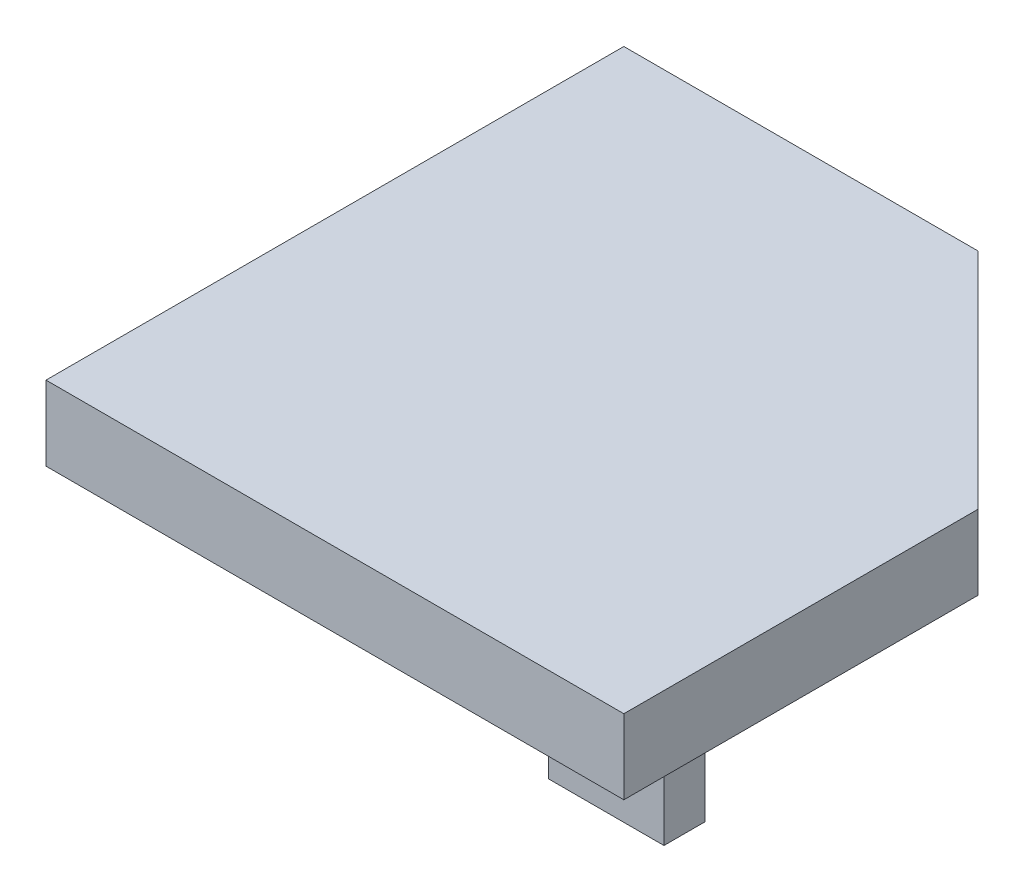
ISO-10303-21;
HEADER;
FILE_DESCRIPTION(('STEP AP214'),'2;1');
FILE_NAME('part.step','',(''),(''),'','','');
FILE_SCHEMA(('AUTOMOTIVE_DESIGN { 1 0 10303 214 1 1 1 1 }'));
ENDSEC;
DATA;
#1=APPLICATION_CONTEXT('core data for automotive mechanical design processes');
#2=APPLICATION_PROTOCOL_DEFINITION('international standard','automotive_design',2000,#1);
#3=PRODUCT_CONTEXT('',#1,'mechanical');
#4=PRODUCT('Part','Part','',(#3));
#5=PRODUCT_RELATED_PRODUCT_CATEGORY('part','',(#4));
#6=PRODUCT_DEFINITION_FORMATION('','',#4);
#7=PRODUCT_DEFINITION_CONTEXT('part definition',#1,'design');
#8=PRODUCT_DEFINITION('design','',#6,#7);
#9=PRODUCT_DEFINITION_SHAPE('','',#8);
#10=(LENGTH_UNIT() NAMED_UNIT(*) SI_UNIT(.MILLI.,.METRE.));
#11=(NAMED_UNIT(*) PLANE_ANGLE_UNIT() SI_UNIT($,.RADIAN.));
#12=(NAMED_UNIT(*) SI_UNIT($,.STERADIAN.) SOLID_ANGLE_UNIT());
#13=UNCERTAINTY_MEASURE_WITH_UNIT(LENGTH_MEASURE(1.E-05),#10,'distance_accuracy_value','');
#14=(GEOMETRIC_REPRESENTATION_CONTEXT(3) GLOBAL_UNCERTAINTY_ASSIGNED_CONTEXT((#13)) GLOBAL_UNIT_ASSIGNED_CONTEXT((#10,
#11,#12)) REPRESENTATION_CONTEXT('',''));
#15=CARTESIAN_POINT('',(0.,0.,0.));
#16=DIRECTION('',(0.,0.,1.));
#17=DIRECTION('',(1.,0.,0.));
#18=AXIS2_PLACEMENT_3D('',#15,#16,#17);
#19=CARTESIAN_POINT('',(0.,0.,0.));
#20=DIRECTION('',(0.,-1.,0.));
#21=DIRECTION('',(0.,0.,-1.));
#22=AXIS2_PLACEMENT_3D('',#19,#20,#21);
#23=PLANE('',#22);
#24=DIRECTION('',(-1.,0.,0.));
#25=VECTOR('',#24,1.);
#26=CARTESIAN_POINT('',(-9.8425,0.,-9.84250000000001));
#27=LINE('',#26,#25);
#28=CARTESIAN_POINT('',(2.22250000000001,0.,-9.84250000000001));
#29=VERTEX_POINT('',#28);
#30=CARTESIAN_POINT('',(-9.8425,0.,-9.84250000000001));
#31=VERTEX_POINT('',#30);
#32=EDGE_CURVE('E202',#29,#31,#27,.T.);
#33=ORIENTED_EDGE('',*,*,#32,.F.);
#34=DIRECTION('',(-0.707106781186546,0.,-0.707106781186549));
#35=VECTOR('',#34,1.);
#36=CARTESIAN_POINT('',(6.03250000000001,0.,-6.03249999999999));
#37=LINE('',#36,#35);
#38=CARTESIAN_POINT('',(9.8425,0.,-2.22249999999999));
#39=VERTEX_POINT('',#38);
#40=EDGE_CURVE('E58',#29,#39,#37,.F.);
#41=ORIENTED_EDGE('',*,*,#40,.T.);
#42=DIRECTION('',(0.,0.,-1.));
#43=VECTOR('',#42,1.);
#44=CARTESIAN_POINT('',(9.8425,0.,9.84249999999999));
#45=LINE('',#44,#43);
#46=CARTESIAN_POINT('',(9.8425,0.,9.84249999999999));
#47=VERTEX_POINT('',#46);
#48=EDGE_CURVE('E190',#47,#39,#45,.T.);
#49=ORIENTED_EDGE('',*,*,#48,.F.);
#50=DIRECTION('',(1.,0.,0.));
#51=VECTOR('',#50,1.);
#52=CARTESIAN_POINT('',(-9.8425,0.,9.8425));
#53=LINE('',#52,#51);
#54=CARTESIAN_POINT('',(-9.8425,0.,9.8425));
#55=VERTEX_POINT('',#54);
#56=EDGE_CURVE('E194',#55,#47,#53,.T.);
#57=ORIENTED_EDGE('',*,*,#56,.F.);
#58=DIRECTION('',(0.,0.,1.));
#59=VECTOR('',#58,1.);
#60=CARTESIAN_POINT('',(-9.8425,0.,9.8425));
#61=LINE('',#60,#59);
#62=EDGE_CURVE('E204',#31,#55,#61,.T.);
#63=ORIENTED_EDGE('',*,*,#62,.F.);
#64=EDGE_LOOP('',(#33,#41,#49,#57,#63));
#65=FACE_BOUND('',#64,.T.);
#66=DIRECTION('',(-1.,0.,0.));
#67=VECTOR('',#66,1.);
#68=CARTESIAN_POINT('',(-5.68325,0.,-3.11150000000001));
#69=LINE('',#68,#67);
#70=CARTESIAN_POINT('',(-4.28625,0.,-3.11150000000001));
#71=VERTEX_POINT('',#70);
#72=CARTESIAN_POINT('',(-5.68325,0.,-3.11150000000001));
#73=VERTEX_POINT('',#72);
#74=EDGE_CURVE('E159',#71,#73,#69,.T.);
#75=ORIENTED_EDGE('',*,*,#74,.F.);
#76=DIRECTION('',(0.,0.,1.));
#77=VECTOR('',#76,1.);
#78=CARTESIAN_POINT('',(-4.28625,0.,-7.04850000000001));
#79=LINE('',#78,#77);
#80=CARTESIAN_POINT('',(-4.28625,0.,-7.04850000000001));
#81=VERTEX_POINT('',#80);
#82=EDGE_CURVE('E156',#81,#71,#79,.T.);
#83=ORIENTED_EDGE('',*,*,#82,.F.);
#84=DIRECTION('',(1.,0.,0.));
#85=VECTOR('',#84,1.);
#86=CARTESIAN_POINT('',(-5.68325,0.,-7.04850000000001));
#87=LINE('',#86,#85);
#88=CARTESIAN_POINT('',(-5.68325,0.,-7.04850000000001));
#89=VERTEX_POINT('',#88);
#90=EDGE_CURVE('E169',#89,#81,#87,.T.);
#91=ORIENTED_EDGE('',*,*,#90,.F.);
#92=DIRECTION('',(0.,0.,-1.));
#93=VECTOR('',#92,1.);
#94=CARTESIAN_POINT('',(-5.68325,0.,-7.04850000000001));
#95=LINE('',#94,#93);
#96=EDGE_CURVE('E177',#73,#89,#95,.T.);
#97=ORIENTED_EDGE('',*,*,#96,.F.);
#98=EDGE_LOOP('',(#75,#83,#91,#97));
#99=FACE_BOUND('',#98,.T.);
#100=DIRECTION('',(-1.,0.,0.));
#101=VECTOR('',#100,1.);
#102=CARTESIAN_POINT('',(3.3655,0.,5.93598));
#103=LINE('',#102,#101);
#104=CARTESIAN_POINT('',(7.3025,0.,5.93598));
#105=VERTEX_POINT('',#104);
#106=CARTESIAN_POINT('',(3.3655,0.,5.93598));
#107=VERTEX_POINT('',#106);
#108=EDGE_CURVE('E396',#105,#107,#103,.T.);
#109=ORIENTED_EDGE('',*,*,#108,.F.);
#110=DIRECTION('',(0.,0.,1.));
#111=VECTOR('',#110,1.);
#112=CARTESIAN_POINT('',(7.3025,0.,4.53898));
#113=LINE('',#112,#111);
#114=CARTESIAN_POINT('',(7.3025,0.,4.53898));
#115=VERTEX_POINT('',#114);
#116=EDGE_CURVE('E154',#115,#105,#113,.T.);
#117=ORIENTED_EDGE('',*,*,#116,.F.);
#118=DIRECTION('',(1.,0.,0.));
#119=VECTOR('',#118,1.);
#120=CARTESIAN_POINT('',(3.3655,0.,4.53898));
#121=LINE('',#120,#119);
#122=CARTESIAN_POINT('',(3.3655,0.,4.53898));
#123=VERTEX_POINT('',#122);
#124=EDGE_CURVE('E150',#123,#115,#121,.T.);
#125=ORIENTED_EDGE('',*,*,#124,.F.);
#126=DIRECTION('',(0.,0.,-1.));
#127=VECTOR('',#126,1.);
#128=CARTESIAN_POINT('',(3.3655,0.,4.53898));
#129=LINE('',#128,#127);
#130=EDGE_CURVE('E393',#107,#123,#129,.T.);
#131=ORIENTED_EDGE('',*,*,#130,.F.);
#132=EDGE_LOOP('',(#109,#117,#125,#131));
#133=FACE_BOUND('',#132,.T.);
#134=ADVANCED_FACE('F36',(#65,#99,#133),#23,.T.);
#135=CARTESIAN_POINT('',(9.8425,2.54,9.84249999999999));
#136=DIRECTION('',(-1.,0.,0.));
#137=DIRECTION('',(0.,0.,1.));
#138=AXIS2_PLACEMENT_3D('',#135,#136,#137);
#139=PLANE('',#138);
#140=ORIENTED_EDGE('',*,*,#48,.T.);
#141=DIRECTION('',(0.,1.,0.));
#142=VECTOR('',#141,1.);
#143=CARTESIAN_POINT('',(9.8425,2.54,-2.22249999999999));
#144=LINE('',#143,#142);
#145=CARTESIAN_POINT('',(9.8425,2.54,-2.22249999999999));
#146=VERTEX_POINT('',#145);
#147=EDGE_CURVE('E44',#39,#146,#144,.T.);
#148=ORIENTED_EDGE('',*,*,#147,.T.);
#149=DIRECTION('',(0.,0.,-1.));
#150=VECTOR('',#149,1.);
#151=CARTESIAN_POINT('',(9.8425,2.54,9.84249999999999));
#152=LINE('',#151,#150);
#153=CARTESIAN_POINT('',(9.8425,2.54,9.84249999999999));
#154=VERTEX_POINT('',#153);
#155=EDGE_CURVE('E191',#154,#146,#152,.T.);
#156=ORIENTED_EDGE('',*,*,#155,.F.);
#157=DIRECTION('',(0.,-1.,0.));
#158=VECTOR('',#157,1.);
#159=CARTESIAN_POINT('',(9.8425,2.54,9.84249999999999));
#160=LINE('',#159,#158);
#161=EDGE_CURVE('E200',#154,#47,#160,.T.);
#162=ORIENTED_EDGE('',*,*,#161,.T.);
#163=EDGE_LOOP('',(#140,#148,#156,#162));
#164=FACE_BOUND('',#163,.T.);
#165=ADVANCED_FACE('F245',(#164),#139,.F.);
#166=CARTESIAN_POINT('',(-9.8425,2.54,-9.84250000000001));
#167=DIRECTION('',(0.,0.,1.));
#168=DIRECTION('',(1.,0.,0.));
#169=AXIS2_PLACEMENT_3D('',#166,#167,#168);
#170=PLANE('',#169);
#171=DIRECTION('',(-1.,0.,0.));
#172=VECTOR('',#171,1.);
#173=CARTESIAN_POINT('',(-9.8425,2.54,-9.84250000000001));
#174=LINE('',#173,#172);
#175=CARTESIAN_POINT('',(2.22250000000001,2.54,-9.84250000000001));
#176=VERTEX_POINT('',#175);
#177=CARTESIAN_POINT('',(-9.8425,2.54,-9.84250000000001));
#178=VERTEX_POINT('',#177);
#179=EDGE_CURVE('E193',#176,#178,#174,.T.);
#180=ORIENTED_EDGE('',*,*,#179,.F.);
#181=DIRECTION('',(0.,-1.,0.));
#182=VECTOR('',#181,1.);
#183=CARTESIAN_POINT('',(2.22250000000001,2.54,-9.84250000000001));
#184=LINE('',#183,#182);
#185=EDGE_CURVE('E215',#176,#29,#184,.T.);
#186=ORIENTED_EDGE('',*,*,#185,.T.);
#187=ORIENTED_EDGE('',*,*,#32,.T.);
#188=DIRECTION('',(0.,-1.,0.));
#189=VECTOR('',#188,1.);
#190=CARTESIAN_POINT('',(-9.8425,2.54,-9.84250000000001));
#191=LINE('',#190,#189);
#192=EDGE_CURVE('E212',#178,#31,#191,.T.);
#193=ORIENTED_EDGE('',*,*,#192,.F.);
#194=EDGE_LOOP('',(#180,#186,#187,#193));
#195=FACE_BOUND('',#194,.T.);
#196=ADVANCED_FACE('F221',(#195),#170,.F.);
#197=CARTESIAN_POINT('',(-9.8425,2.54,9.8425));
#198=DIRECTION('',(1.,0.,0.));
#199=DIRECTION('',(0.,0.,-1.));
#200=AXIS2_PLACEMENT_3D('',#197,#198,#199);
#201=PLANE('',#200);
#202=ORIENTED_EDGE('',*,*,#62,.T.);
#203=DIRECTION('',(0.,-1.,0.));
#204=VECTOR('',#203,1.);
#205=CARTESIAN_POINT('',(-9.8425,2.54,9.8425));
#206=LINE('',#205,#204);
#207=CARTESIAN_POINT('',(-9.8425,2.54,9.8425));
#208=VERTEX_POINT('',#207);
#209=EDGE_CURVE('E209',#208,#55,#206,.T.);
#210=ORIENTED_EDGE('',*,*,#209,.F.);
#211=DIRECTION('',(0.,0.,1.));
#212=VECTOR('',#211,1.);
#213=CARTESIAN_POINT('',(-9.8425,2.54,9.8425));
#214=LINE('',#213,#212);
#215=EDGE_CURVE('E196',#178,#208,#214,.T.);
#216=ORIENTED_EDGE('',*,*,#215,.F.);
#217=ORIENTED_EDGE('',*,*,#192,.T.);
#218=EDGE_LOOP('',(#202,#210,#216,#217));
#219=FACE_BOUND('',#218,.T.);
#220=ADVANCED_FACE('F230',(#219),#201,.F.);
#221=CARTESIAN_POINT('',(-9.8425,2.54,9.8425));
#222=DIRECTION('',(0.,0.,-1.));
#223=DIRECTION('',(-1.,0.,0.));
#224=AXIS2_PLACEMENT_3D('',#221,#222,#223);
#225=PLANE('',#224);
#226=ORIENTED_EDGE('',*,*,#56,.T.);
#227=ORIENTED_EDGE('',*,*,#161,.F.);
#228=DIRECTION('',(1.,0.,0.));
#229=VECTOR('',#228,1.);
#230=CARTESIAN_POINT('',(-9.8425,2.54,9.8425));
#231=LINE('',#230,#229);
#232=EDGE_CURVE('E198',#208,#154,#231,.T.);
#233=ORIENTED_EDGE('',*,*,#232,.F.);
#234=ORIENTED_EDGE('',*,*,#209,.T.);
#235=EDGE_LOOP('',(#226,#227,#233,#234));
#236=FACE_BOUND('',#235,.T.);
#237=ADVANCED_FACE('F234',(#236),#225,.F.);
#238=CARTESIAN_POINT('',(0.,2.54,0.));
#239=DIRECTION('',(0.,-1.,0.));
#240=DIRECTION('',(0.,0.,-1.));
#241=AXIS2_PLACEMENT_3D('',#238,#239,#240);
#242=PLANE('',#241);
#243=ORIENTED_EDGE('',*,*,#155,.T.);
#244=DIRECTION('',(0.707106781186546,0.,0.707106781186549));
#245=VECTOR('',#244,1.);
#246=CARTESIAN_POINT('',(2.22250000000001,2.54,-9.84250000000001));
#247=LINE('',#246,#245);
#248=EDGE_CURVE('E11',#146,#176,#247,.F.);
#249=ORIENTED_EDGE('',*,*,#248,.T.);
#250=ORIENTED_EDGE('',*,*,#179,.T.);
#251=ORIENTED_EDGE('',*,*,#215,.T.);
#252=ORIENTED_EDGE('',*,*,#232,.T.);
#253=EDGE_LOOP('',(#243,#249,#250,#251,#252));
#254=FACE_BOUND('',#253,.T.);
#255=ADVANCED_FACE('F237',(#254),#242,.F.);
#256=CARTESIAN_POINT('',(-4.28625,-4.572,-7.04850000000001));
#257=DIRECTION('',(-1.,0.,0.));
#258=DIRECTION('',(0.,0.,1.));
#259=AXIS2_PLACEMENT_3D('',#256,#257,#258);
#260=PLANE('',#259);
#261=ORIENTED_EDGE('',*,*,#82,.T.);
#262=DIRECTION('',(0.,1.,0.));
#263=VECTOR('',#262,1.);
#264=CARTESIAN_POINT('',(-4.28625,-4.572,-3.11150000000001));
#265=LINE('',#264,#263);
#266=CARTESIAN_POINT('',(-4.28625,-4.572,-3.11150000000001));
#267=VERTEX_POINT('',#266);
#268=EDGE_CURVE('E188',#267,#71,#265,.T.);
#269=ORIENTED_EDGE('',*,*,#268,.F.);
#270=DIRECTION('',(0.,0.,1.));
#271=VECTOR('',#270,1.);
#272=CARTESIAN_POINT('',(-4.28625,-4.572,-7.04850000000001));
#273=LINE('',#272,#271);
#274=CARTESIAN_POINT('',(-4.28625,-4.572,-7.04850000000001));
#275=VERTEX_POINT('',#274);
#276=EDGE_CURVE('E165',#275,#267,#273,.T.);
#277=ORIENTED_EDGE('',*,*,#276,.F.);
#278=DIRECTION('',(0.,1.,0.));
#279=VECTOR('',#278,1.);
#280=CARTESIAN_POINT('',(-4.28625,-4.572,-7.04850000000001));
#281=LINE('',#280,#279);
#282=EDGE_CURVE('E174',#275,#81,#281,.T.);
#283=ORIENTED_EDGE('',*,*,#282,.T.);
#284=EDGE_LOOP('',(#261,#269,#277,#283));
#285=FACE_BOUND('',#284,.T.);
#286=ADVANCED_FACE('F277',(#285),#260,.F.);
#287=CARTESIAN_POINT('',(-5.68325,-4.572,-3.11150000000001));
#288=DIRECTION('',(0.,0.,-1.));
#289=DIRECTION('',(-1.,0.,0.));
#290=AXIS2_PLACEMENT_3D('',#287,#288,#289);
#291=PLANE('',#290);
#292=ORIENTED_EDGE('',*,*,#74,.T.);
#293=DIRECTION('',(0.,1.,0.));
#294=VECTOR('',#293,1.);
#295=CARTESIAN_POINT('',(-5.68325,-4.572,-3.11150000000001));
#296=LINE('',#295,#294);
#297=CARTESIAN_POINT('',(-5.68325,-4.572,-3.11150000000001));
#298=VERTEX_POINT('',#297);
#299=EDGE_CURVE('E185',#298,#73,#296,.T.);
#300=ORIENTED_EDGE('',*,*,#299,.F.);
#301=DIRECTION('',(-1.,0.,0.));
#302=VECTOR('',#301,1.);
#303=CARTESIAN_POINT('',(-5.68325,-4.572,-3.11150000000001));
#304=LINE('',#303,#302);
#305=EDGE_CURVE('E168',#267,#298,#304,.T.);
#306=ORIENTED_EDGE('',*,*,#305,.F.);
#307=ORIENTED_EDGE('',*,*,#268,.T.);
#308=EDGE_LOOP('',(#292,#300,#306,#307));
#309=FACE_BOUND('',#308,.T.);
#310=ADVANCED_FACE('F282',(#309),#291,.F.);
#311=CARTESIAN_POINT('',(-5.68325,-4.572,-7.04850000000001));
#312=DIRECTION('',(1.,0.,0.));
#313=DIRECTION('',(0.,0.,-1.));
#314=AXIS2_PLACEMENT_3D('',#311,#312,#313);
#315=PLANE('',#314);
#316=ORIENTED_EDGE('',*,*,#96,.T.);
#317=DIRECTION('',(0.,1.,0.));
#318=VECTOR('',#317,1.);
#319=CARTESIAN_POINT('',(-5.68325,-4.572,-7.04850000000001));
#320=LINE('',#319,#318);
#321=CARTESIAN_POINT('',(-5.68325,-4.572,-7.04850000000001));
#322=VERTEX_POINT('',#321);
#323=EDGE_CURVE('E183',#322,#89,#320,.T.);
#324=ORIENTED_EDGE('',*,*,#323,.F.);
#325=DIRECTION('',(0.,0.,-1.));
#326=VECTOR('',#325,1.);
#327=CARTESIAN_POINT('',(-5.68325,-4.572,-7.04850000000001));
#328=LINE('',#327,#326);
#329=EDGE_CURVE('E171',#298,#322,#328,.T.);
#330=ORIENTED_EDGE('',*,*,#329,.F.);
#331=ORIENTED_EDGE('',*,*,#299,.T.);
#332=EDGE_LOOP('',(#316,#324,#330,#331));
#333=FACE_BOUND('',#332,.T.);
#334=ADVANCED_FACE('F289',(#333),#315,.F.);
#335=CARTESIAN_POINT('',(-5.68325,-4.572,-7.04850000000001));
#336=DIRECTION('',(0.,0.,1.));
#337=DIRECTION('',(1.,0.,0.));
#338=AXIS2_PLACEMENT_3D('',#335,#336,#337);
#339=PLANE('',#338);
#340=ORIENTED_EDGE('',*,*,#90,.T.);
#341=ORIENTED_EDGE('',*,*,#282,.F.);
#342=DIRECTION('',(1.,0.,0.));
#343=VECTOR('',#342,1.);
#344=CARTESIAN_POINT('',(-5.68325,-4.572,-7.04850000000001));
#345=LINE('',#344,#343);
#346=EDGE_CURVE('E173',#322,#275,#345,.T.);
#347=ORIENTED_EDGE('',*,*,#346,.F.);
#348=ORIENTED_EDGE('',*,*,#323,.T.);
#349=EDGE_LOOP('',(#340,#341,#347,#348));
#350=FACE_BOUND('',#349,.T.);
#351=ADVANCED_FACE('F297',(#350),#339,.F.);
#352=CARTESIAN_POINT('',(0.,-4.572,0.));
#353=DIRECTION('',(0.,1.,0.));
#354=DIRECTION('',(0.,0.,1.));
#355=AXIS2_PLACEMENT_3D('',#352,#353,#354);
#356=PLANE('',#355);
#357=ORIENTED_EDGE('',*,*,#276,.T.);
#358=ORIENTED_EDGE('',*,*,#305,.T.);
#359=ORIENTED_EDGE('',*,*,#329,.T.);
#360=ORIENTED_EDGE('',*,*,#346,.T.);
#361=EDGE_LOOP('',(#357,#358,#359,#360));
#362=FACE_BOUND('',#361,.T.);
#363=ADVANCED_FACE('F305',(#362),#356,.F.);
#364=CARTESIAN_POINT('',(7.3025,-4.572,4.53898));
#365=DIRECTION('',(-1.,0.,0.));
#366=DIRECTION('',(0.,0.,1.));
#367=AXIS2_PLACEMENT_3D('',#364,#365,#366);
#368=PLANE('',#367);
#369=ORIENTED_EDGE('',*,*,#116,.T.);
#370=DIRECTION('',(0.,1.,0.));
#371=VECTOR('',#370,1.);
#372=CARTESIAN_POINT('',(7.3025,-4.572,5.93598));
#373=LINE('',#372,#371);
#374=CARTESIAN_POINT('',(7.3025,-4.572,5.93598));
#375=VERTEX_POINT('',#374);
#376=EDGE_CURVE('E134',#375,#105,#373,.T.);
#377=ORIENTED_EDGE('',*,*,#376,.F.);
#378=DIRECTION('',(0.,0.,1.));
#379=VECTOR('',#378,1.);
#380=CARTESIAN_POINT('',(7.3025,-4.572,4.53898));
#381=LINE('',#380,#379);
#382=CARTESIAN_POINT('',(7.3025,-4.572,4.53898));
#383=VERTEX_POINT('',#382);
#384=EDGE_CURVE('E141',#383,#375,#381,.T.);
#385=ORIENTED_EDGE('',*,*,#384,.F.);
#386=DIRECTION('',(0.,1.,0.));
#387=VECTOR('',#386,1.);
#388=CARTESIAN_POINT('',(7.3025,-4.572,4.53898));
#389=LINE('',#388,#387);
#390=EDGE_CURVE('E388',#383,#115,#389,.T.);
#391=ORIENTED_EDGE('',*,*,#390,.T.);
#392=EDGE_LOOP('',(#369,#377,#385,#391));
#393=FACE_BOUND('',#392,.T.);
#394=ADVANCED_FACE('F152',(#393),#368,.F.);
#395=CARTESIAN_POINT('',(3.3655,-4.572,5.93598));
#396=DIRECTION('',(0.,0.,-1.));
#397=DIRECTION('',(-1.,0.,0.));
#398=AXIS2_PLACEMENT_3D('',#395,#396,#397);
#399=PLANE('',#398);
#400=ORIENTED_EDGE('',*,*,#108,.T.);
#401=DIRECTION('',(0.,1.,0.));
#402=VECTOR('',#401,1.);
#403=CARTESIAN_POINT('',(3.3655,-4.572,5.93598));
#404=LINE('',#403,#402);
#405=CARTESIAN_POINT('',(3.3655,-4.572,5.93598));
#406=VERTEX_POINT('',#405);
#407=EDGE_CURVE('E137',#406,#107,#404,.T.);
#408=ORIENTED_EDGE('',*,*,#407,.F.);
#409=DIRECTION('',(-1.,0.,0.));
#410=VECTOR('',#409,1.);
#411=CARTESIAN_POINT('',(3.3655,-4.572,5.93598));
#412=LINE('',#411,#410);
#413=EDGE_CURVE('E130',#375,#406,#412,.T.);
#414=ORIENTED_EDGE('',*,*,#413,.F.);
#415=ORIENTED_EDGE('',*,*,#376,.T.);
#416=EDGE_LOOP('',(#400,#408,#414,#415));
#417=FACE_BOUND('',#416,.T.);
#418=ADVANCED_FACE('F132',(#417),#399,.F.);
#419=CARTESIAN_POINT('',(3.3655,-4.572,4.53898));
#420=DIRECTION('',(1.,0.,0.));
#421=DIRECTION('',(0.,0.,-1.));
#422=AXIS2_PLACEMENT_3D('',#419,#420,#421);
#423=PLANE('',#422);
#424=ORIENTED_EDGE('',*,*,#130,.T.);
#425=DIRECTION('',(0.,1.,0.));
#426=VECTOR('',#425,1.);
#427=CARTESIAN_POINT('',(3.3655,-4.572,4.53898));
#428=LINE('',#427,#426);
#429=CARTESIAN_POINT('',(3.3655,-4.572,4.53898));
#430=VERTEX_POINT('',#429);
#431=EDGE_CURVE('E161',#430,#123,#428,.T.);
#432=ORIENTED_EDGE('',*,*,#431,.F.);
#433=DIRECTION('',(0.,0.,-1.));
#434=VECTOR('',#433,1.);
#435=CARTESIAN_POINT('',(3.3655,-4.572,4.53898));
#436=LINE('',#435,#434);
#437=EDGE_CURVE('E140',#406,#430,#436,.T.);
#438=ORIENTED_EDGE('',*,*,#437,.F.);
#439=ORIENTED_EDGE('',*,*,#407,.T.);
#440=EDGE_LOOP('',(#424,#432,#438,#439));
#441=FACE_BOUND('',#440,.T.);
#442=ADVANCED_FACE('F326',(#441),#423,.F.);
#443=CARTESIAN_POINT('',(3.3655,-4.572,4.53898));
#444=DIRECTION('',(0.,0.,1.));
#445=DIRECTION('',(1.,0.,0.));
#446=AXIS2_PLACEMENT_3D('',#443,#444,#445);
#447=PLANE('',#446);
#448=ORIENTED_EDGE('',*,*,#124,.T.);
#449=ORIENTED_EDGE('',*,*,#390,.F.);
#450=DIRECTION('',(1.,0.,0.));
#451=VECTOR('',#450,1.);
#452=CARTESIAN_POINT('',(3.3655,-4.572,4.53898));
#453=LINE('',#452,#451);
#454=EDGE_CURVE('E146',#430,#383,#453,.T.);
#455=ORIENTED_EDGE('',*,*,#454,.F.);
#456=ORIENTED_EDGE('',*,*,#431,.T.);
#457=EDGE_LOOP('',(#448,#449,#455,#456));
#458=FACE_BOUND('',#457,.T.);
#459=ADVANCED_FACE('F242',(#458),#447,.F.);
#460=CARTESIAN_POINT('',(0.,-4.572,0.));
#461=DIRECTION('',(0.,1.,0.));
#462=DIRECTION('',(0.,0.,1.));
#463=AXIS2_PLACEMENT_3D('',#460,#461,#462);
#464=PLANE('',#463);
#465=ORIENTED_EDGE('',*,*,#384,.T.);
#466=ORIENTED_EDGE('',*,*,#413,.T.);
#467=ORIENTED_EDGE('',*,*,#437,.T.);
#468=ORIENTED_EDGE('',*,*,#454,.T.);
#469=EDGE_LOOP('',(#465,#466,#467,#468));
#470=FACE_BOUND('',#469,.T.);
#471=ADVANCED_FACE('F144',(#470),#464,.F.);
#472=CARTESIAN_POINT('',(2.22250000000001,2.54,-9.84250000000001));
#473=DIRECTION('',(-0.707106781186549,0.,0.707106781186546));
#474=DIRECTION('',(0.,-1.,0.));
#475=AXIS2_PLACEMENT_3D('',#472,#473,#474);
#476=PLANE('',#475);
#477=ORIENTED_EDGE('',*,*,#248,.F.);
#478=ORIENTED_EDGE('',*,*,#147,.F.);
#479=ORIENTED_EDGE('',*,*,#40,.F.);
#480=ORIENTED_EDGE('',*,*,#185,.F.);
#481=EDGE_LOOP('',(#477,#478,#479,#480));
#482=FACE_BOUND('',#481,.T.);
#483=ADVANCED_FACE('F38',(#482),#476,.F.);
#484=CLOSED_SHELL('',(#134,#165,#196,#220,#237,#255,#286,#310,#334,#351,#363,#394,#418,#442,
#459,#471,#483));
#485=MANIFOLD_SOLID_BREP('B2',#484);
#486=ADVANCED_BREP_SHAPE_REPRESENTATION('',(#18,#485),#14);
#487=SHAPE_DEFINITION_REPRESENTATION(#9,#486);
ENDSEC;
END-ISO-10303-21;
